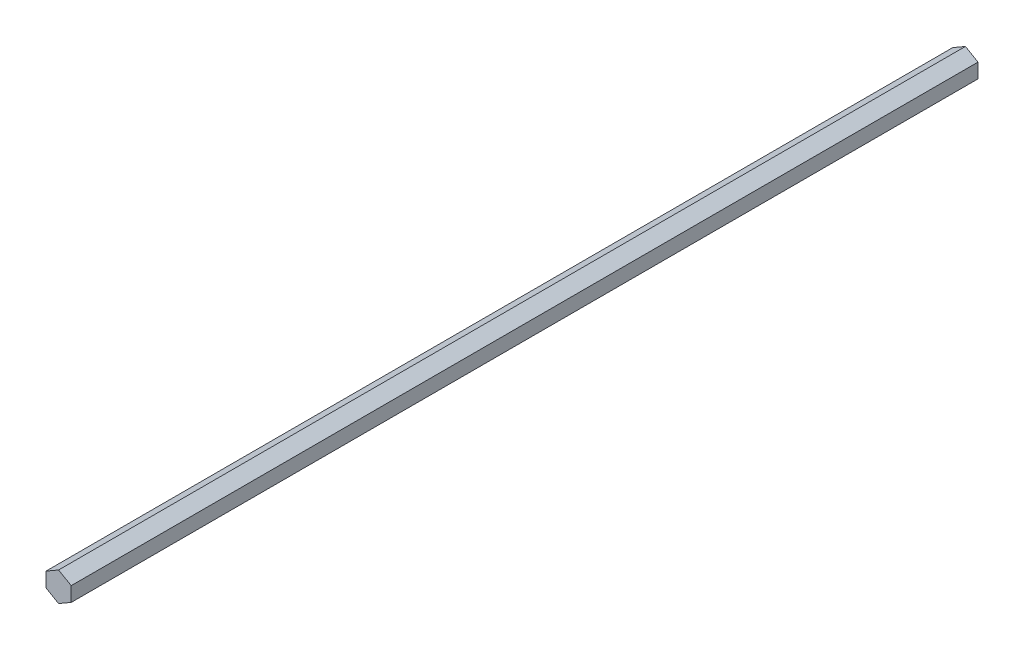
ISO-10303-21;
HEADER;
FILE_DESCRIPTION(('STEP AP214'),'2;1');
FILE_NAME('part.step','',(''),(''),'','','');
FILE_SCHEMA(('AUTOMOTIVE_DESIGN { 1 0 10303 214 1 1 1 1 }'));
ENDSEC;
DATA;
#1=APPLICATION_CONTEXT('core data for automotive mechanical design processes');
#2=APPLICATION_PROTOCOL_DEFINITION('international standard','automotive_design',2000,#1);
#3=PRODUCT_CONTEXT('',#1,'mechanical');
#4=PRODUCT('Part','Part','',(#3));
#5=PRODUCT_RELATED_PRODUCT_CATEGORY('part','',(#4));
#6=PRODUCT_DEFINITION_FORMATION('','',#4);
#7=PRODUCT_DEFINITION_CONTEXT('part definition',#1,'design');
#8=PRODUCT_DEFINITION('design','',#6,#7);
#9=PRODUCT_DEFINITION_SHAPE('','',#8);
#10=(LENGTH_UNIT() NAMED_UNIT(*) SI_UNIT(.MILLI.,.METRE.));
#11=(NAMED_UNIT(*) PLANE_ANGLE_UNIT() SI_UNIT($,.RADIAN.));
#12=(NAMED_UNIT(*) SI_UNIT($,.STERADIAN.) SOLID_ANGLE_UNIT());
#13=UNCERTAINTY_MEASURE_WITH_UNIT(LENGTH_MEASURE(1.E-05),#10,'distance_accuracy_value','');
#14=(GEOMETRIC_REPRESENTATION_CONTEXT(3) GLOBAL_UNCERTAINTY_ASSIGNED_CONTEXT((#13)) GLOBAL_UNIT_ASSIGNED_CONTEXT((#10,
#11,#12)) REPRESENTATION_CONTEXT('',''));
#15=CARTESIAN_POINT('',(0.,0.,0.));
#16=DIRECTION('',(0.,0.,1.));
#17=DIRECTION('',(1.,0.,0.));
#18=AXIS2_PLACEMENT_3D('',#15,#16,#17);
#19=CARTESIAN_POINT('',(6.35,-3.66617420935412,228.6));
#20=DIRECTION('',(-1.,0.,0.));
#21=DIRECTION('',(0.,-1.,0.));
#22=AXIS2_PLACEMENT_3D('',#19,#20,#21);
#23=PLANE('',#22);
#24=DIRECTION('',(0.,1.,0.));
#25=VECTOR('',#24,1.);
#26=CARTESIAN_POINT('',(6.35,-3.66617420935412,-228.6));
#27=LINE('',#26,#25);
#28=CARTESIAN_POINT('',(6.35,-3.66617420935412,-228.6));
#29=VERTEX_POINT('',#28);
#30=CARTESIAN_POINT('',(6.35,3.66617420935412,-228.6));
#31=VERTEX_POINT('',#30);
#32=EDGE_CURVE('E128',#29,#31,#27,.T.);
#33=ORIENTED_EDGE('',*,*,#32,.T.);
#34=DIRECTION('',(0.,0.,-1.));
#35=VECTOR('',#34,1.);
#36=CARTESIAN_POINT('',(6.35,3.66617420935412,228.6));
#37=LINE('',#36,#35);
#38=CARTESIAN_POINT('',(6.35,3.66617420935412,228.6));
#39=VERTEX_POINT('',#38);
#40=EDGE_CURVE('E11',#39,#31,#37,.T.);
#41=ORIENTED_EDGE('',*,*,#40,.F.);
#42=DIRECTION('',(0.,1.,0.));
#43=VECTOR('',#42,1.);
#44=CARTESIAN_POINT('',(6.35,-3.66617420935412,228.6));
#45=LINE('',#44,#43);
#46=CARTESIAN_POINT('',(6.35,-3.66617420935412,228.6));
#47=VERTEX_POINT('',#46);
#48=EDGE_CURVE('E144',#47,#39,#45,.T.);
#49=ORIENTED_EDGE('',*,*,#48,.F.);
#50=DIRECTION('',(0.,0.,-1.));
#51=VECTOR('',#50,1.);
#52=CARTESIAN_POINT('',(6.35,-3.66617420935412,228.6));
#53=LINE('',#52,#51);
#54=EDGE_CURVE('E124',#47,#29,#53,.T.);
#55=ORIENTED_EDGE('',*,*,#54,.T.);
#56=EDGE_LOOP('',(#33,#41,#49,#55));
#57=FACE_BOUND('',#56,.T.);
#58=ADVANCED_FACE('F39',(#57),#23,.F.);
#59=CARTESIAN_POINT('',(6.35,3.66617420935412,228.6));
#60=DIRECTION('',(-0.5,-0.866025403784439,0.));
#61=DIRECTION('',(0.866025403784439,-0.5,0.));
#62=AXIS2_PLACEMENT_3D('',#59,#60,#61);
#63=PLANE('',#62);
#64=DIRECTION('',(-0.866025403784439,0.5,0.));
#65=VECTOR('',#64,1.);
#66=CARTESIAN_POINT('',(6.35,3.66617420935412,-228.6));
#67=LINE('',#66,#65);
#68=CARTESIAN_POINT('',(0.,7.33234841870825,-228.6));
#69=VERTEX_POINT('',#68);
#70=EDGE_CURVE('E132',#31,#69,#67,.T.);
#71=ORIENTED_EDGE('',*,*,#70,.T.);
#72=DIRECTION('',(0.,0.,-1.));
#73=VECTOR('',#72,1.);
#74=CARTESIAN_POINT('',(0.,7.33234841870825,228.6));
#75=LINE('',#74,#73);
#76=CARTESIAN_POINT('',(0.,7.33234841870825,228.6));
#77=VERTEX_POINT('',#76);
#78=EDGE_CURVE('E48',#77,#69,#75,.T.);
#79=ORIENTED_EDGE('',*,*,#78,.F.);
#80=DIRECTION('',(-0.866025403784439,0.5,0.));
#81=VECTOR('',#80,1.);
#82=CARTESIAN_POINT('',(6.35,3.66617420935412,228.6));
#83=LINE('',#82,#81);
#84=EDGE_CURVE('E93',#39,#77,#83,.T.);
#85=ORIENTED_EDGE('',*,*,#84,.F.);
#86=ORIENTED_EDGE('',*,*,#40,.T.);
#87=EDGE_LOOP('',(#71,#79,#85,#86));
#88=FACE_BOUND('',#87,.T.);
#89=ADVANCED_FACE('F172',(#88),#63,.F.);
#90=CARTESIAN_POINT('',(0.,7.33234841870825,228.6));
#91=DIRECTION('',(0.5,-0.866025403784439,0.));
#92=DIRECTION('',(0.866025403784439,0.5,0.));
#93=AXIS2_PLACEMENT_3D('',#90,#91,#92);
#94=PLANE('',#93);
#95=DIRECTION('',(-0.866025403784439,-0.5,0.));
#96=VECTOR('',#95,1.);
#97=CARTESIAN_POINT('',(0.,7.33234841870825,-228.6));
#98=LINE('',#97,#96);
#99=CARTESIAN_POINT('',(-6.35,3.66617420935412,-228.6));
#100=VERTEX_POINT('',#99);
#101=EDGE_CURVE('E135',#69,#100,#98,.T.);
#102=ORIENTED_EDGE('',*,*,#101,.T.);
#103=DIRECTION('',(0.,0.,-1.));
#104=VECTOR('',#103,1.);
#105=CARTESIAN_POINT('',(-6.35,3.66617420935412,228.6));
#106=LINE('',#105,#104);
#107=CARTESIAN_POINT('',(-6.35,3.66617420935412,228.6));
#108=VERTEX_POINT('',#107);
#109=EDGE_CURVE('E117',#108,#100,#106,.T.);
#110=ORIENTED_EDGE('',*,*,#109,.F.);
#111=DIRECTION('',(-0.866025403784439,-0.5,0.));
#112=VECTOR('',#111,1.);
#113=CARTESIAN_POINT('',(0.,7.33234841870825,228.6));
#114=LINE('',#113,#112);
#115=EDGE_CURVE('E106',#77,#108,#114,.T.);
#116=ORIENTED_EDGE('',*,*,#115,.F.);
#117=ORIENTED_EDGE('',*,*,#78,.T.);
#118=EDGE_LOOP('',(#102,#110,#116,#117));
#119=FACE_BOUND('',#118,.T.);
#120=ADVANCED_FACE('F154',(#119),#94,.F.);
#121=CARTESIAN_POINT('',(-6.35,3.66617420935412,228.6));
#122=DIRECTION('',(1.,0.,0.));
#123=DIRECTION('',(0.,1.,0.));
#124=AXIS2_PLACEMENT_3D('',#121,#122,#123);
#125=PLANE('',#124);
#126=DIRECTION('',(0.,-1.,0.));
#127=VECTOR('',#126,1.);
#128=CARTESIAN_POINT('',(-6.35,3.66617420935412,-228.6));
#129=LINE('',#128,#127);
#130=CARTESIAN_POINT('',(-6.35,-3.66617420935412,-228.6));
#131=VERTEX_POINT('',#130);
#132=EDGE_CURVE('E115',#100,#131,#129,.T.);
#133=ORIENTED_EDGE('',*,*,#132,.T.);
#134=DIRECTION('',(0.,0.,-1.));
#135=VECTOR('',#134,1.);
#136=CARTESIAN_POINT('',(-6.35,-3.66617420935412,228.6));
#137=LINE('',#136,#135);
#138=CARTESIAN_POINT('',(-6.35,-3.66617420935412,228.6));
#139=VERTEX_POINT('',#138);
#140=EDGE_CURVE('E112',#139,#131,#137,.T.);
#141=ORIENTED_EDGE('',*,*,#140,.F.);
#142=DIRECTION('',(0.,-1.,0.));
#143=VECTOR('',#142,1.);
#144=CARTESIAN_POINT('',(-6.35,3.66617420935412,228.6));
#145=LINE('',#144,#143);
#146=EDGE_CURVE('E100',#108,#139,#145,.T.);
#147=ORIENTED_EDGE('',*,*,#146,.F.);
#148=ORIENTED_EDGE('',*,*,#109,.T.);
#149=EDGE_LOOP('',(#133,#141,#147,#148));
#150=FACE_BOUND('',#149,.T.);
#151=ADVANCED_FACE('F113',(#150),#125,.F.);
#152=CARTESIAN_POINT('',(-6.35,-3.66617420935412,228.6));
#153=DIRECTION('',(0.5,0.866025403784439,0.));
#154=DIRECTION('',(-0.866025403784439,0.5,0.));
#155=AXIS2_PLACEMENT_3D('',#152,#153,#154);
#156=PLANE('',#155);
#157=DIRECTION('',(0.866025403784439,-0.5,0.));
#158=VECTOR('',#157,1.);
#159=CARTESIAN_POINT('',(-6.35,-3.66617420935412,-228.6));
#160=LINE('',#159,#158);
#161=CARTESIAN_POINT('',(0.,-7.33234841870825,-228.6));
#162=VERTEX_POINT('',#161);
#163=EDGE_CURVE('E79',#131,#162,#160,.T.);
#164=ORIENTED_EDGE('',*,*,#163,.T.);
#165=DIRECTION('',(0.,0.,-1.));
#166=VECTOR('',#165,1.);
#167=CARTESIAN_POINT('',(0.,-7.33234841870825,228.6));
#168=LINE('',#167,#166);
#169=CARTESIAN_POINT('',(0.,-7.33234841870825,228.6));
#170=VERTEX_POINT('',#169);
#171=EDGE_CURVE('E118',#170,#162,#168,.T.);
#172=ORIENTED_EDGE('',*,*,#171,.F.);
#173=DIRECTION('',(0.866025403784439,-0.5,0.));
#174=VECTOR('',#173,1.);
#175=CARTESIAN_POINT('',(-6.35,-3.66617420935412,228.6));
#176=LINE('',#175,#174);
#177=EDGE_CURVE('E104',#139,#170,#176,.T.);
#178=ORIENTED_EDGE('',*,*,#177,.F.);
#179=ORIENTED_EDGE('',*,*,#140,.T.);
#180=EDGE_LOOP('',(#164,#172,#178,#179));
#181=FACE_BOUND('',#180,.T.);
#182=ADVANCED_FACE('F120',(#181),#156,.F.);
#183=CARTESIAN_POINT('',(0.,-7.33234841870825,228.6));
#184=DIRECTION('',(-0.5,0.866025403784439,0.));
#185=DIRECTION('',(-0.866025403784439,-0.5,0.));
#186=AXIS2_PLACEMENT_3D('',#183,#184,#185);
#187=PLANE('',#186);
#188=DIRECTION('',(0.866025403784439,0.5,0.));
#189=VECTOR('',#188,1.);
#190=CARTESIAN_POINT('',(0.,-7.33234841870825,-228.6));
#191=LINE('',#190,#189);
#192=EDGE_CURVE('E85',#162,#29,#191,.T.);
#193=ORIENTED_EDGE('',*,*,#192,.T.);
#194=ORIENTED_EDGE('',*,*,#54,.F.);
#195=DIRECTION('',(0.866025403784439,0.5,0.));
#196=VECTOR('',#195,1.);
#197=CARTESIAN_POINT('',(0.,-7.33234841870825,228.6));
#198=LINE('',#197,#196);
#199=EDGE_CURVE('E56',#170,#47,#198,.T.);
#200=ORIENTED_EDGE('',*,*,#199,.F.);
#201=ORIENTED_EDGE('',*,*,#171,.T.);
#202=EDGE_LOOP('',(#193,#194,#200,#201));
#203=FACE_BOUND('',#202,.T.);
#204=ADVANCED_FACE('F161',(#203),#187,.F.);
#205=CARTESIAN_POINT('',(0.,0.,228.6));
#206=DIRECTION('',(0.,0.,1.));
#207=DIRECTION('',(1.,0.,0.));
#208=AXIS2_PLACEMENT_3D('',#205,#206,#207);
#209=PLANE('',#208);
#210=ORIENTED_EDGE('',*,*,#48,.T.);
#211=ORIENTED_EDGE('',*,*,#84,.T.);
#212=ORIENTED_EDGE('',*,*,#115,.T.);
#213=ORIENTED_EDGE('',*,*,#146,.T.);
#214=ORIENTED_EDGE('',*,*,#177,.T.);
#215=ORIENTED_EDGE('',*,*,#199,.T.);
#216=EDGE_LOOP('',(#210,#211,#212,#213,#214,#215));
#217=FACE_BOUND('',#216,.T.);
#218=ADVANCED_FACE('F102',(#217),#209,.T.);
#219=CARTESIAN_POINT('',(0.,0.,-228.6));
#220=DIRECTION('',(0.,0.,1.));
#221=DIRECTION('',(1.,0.,0.));
#222=AXIS2_PLACEMENT_3D('',#219,#220,#221);
#223=PLANE('',#222);
#224=ORIENTED_EDGE('',*,*,#32,.F.);
#225=ORIENTED_EDGE('',*,*,#192,.F.);
#226=ORIENTED_EDGE('',*,*,#163,.F.);
#227=ORIENTED_EDGE('',*,*,#132,.F.);
#228=ORIENTED_EDGE('',*,*,#101,.F.);
#229=ORIENTED_EDGE('',*,*,#70,.F.);
#230=EDGE_LOOP('',(#224,#225,#226,#227,#228,#229));
#231=FACE_BOUND('',#230,.T.);
#232=ADVANCED_FACE('F157',(#231),#223,.F.);
#233=CLOSED_SHELL('',(#58,#89,#120,#151,#182,#204,#218,#232));
#234=MANIFOLD_SOLID_BREP('B2',#233);
#235=ADVANCED_BREP_SHAPE_REPRESENTATION('',(#18,#234),#14);
#236=SHAPE_DEFINITION_REPRESENTATION(#9,#235);
ENDSEC;
END-ISO-10303-21;
